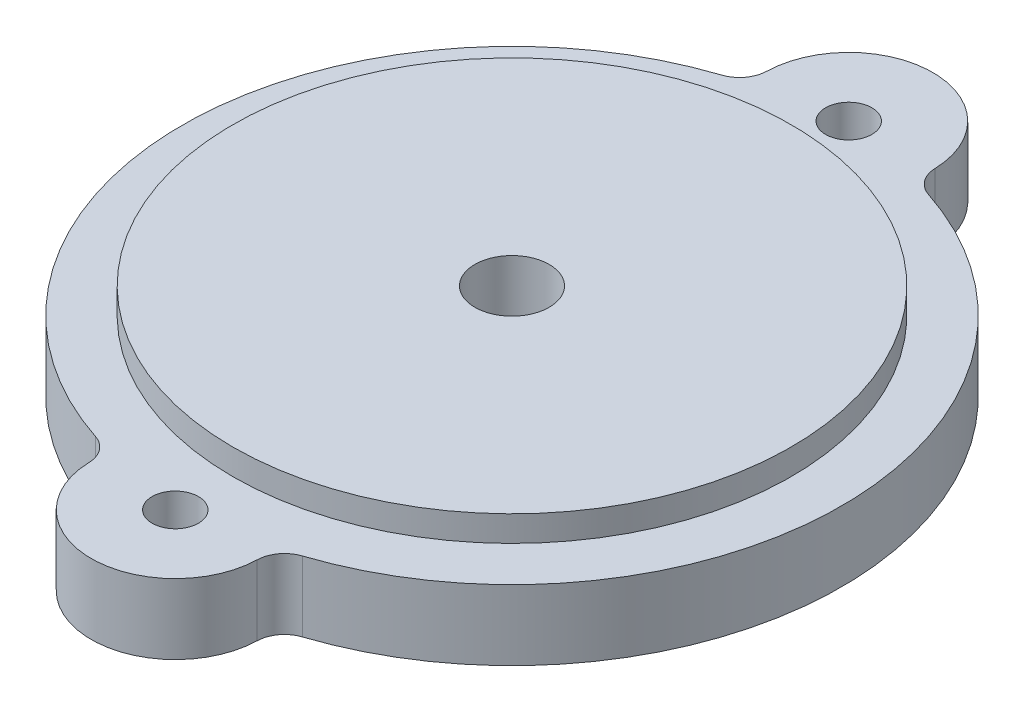
ISO-10303-21;
HEADER;
FILE_DESCRIPTION(('STEP AP214'),'2;1');
FILE_NAME('part.step','',(''),(''),'','','');
FILE_SCHEMA(('AUTOMOTIVE_DESIGN { 1 0 10303 214 1 1 1 1 }'));
ENDSEC;
DATA;
#1=APPLICATION_CONTEXT('core data for automotive mechanical design processes');
#2=APPLICATION_PROTOCOL_DEFINITION('international standard','automotive_design',2000,#1);
#3=PRODUCT_CONTEXT('',#1,'mechanical');
#4=PRODUCT('Part','Part','',(#3));
#5=PRODUCT_RELATED_PRODUCT_CATEGORY('part','',(#4));
#6=PRODUCT_DEFINITION_FORMATION('','',#4);
#7=PRODUCT_DEFINITION_CONTEXT('part definition',#1,'design');
#8=PRODUCT_DEFINITION('design','',#6,#7);
#9=PRODUCT_DEFINITION_SHAPE('','',#8);
#10=(LENGTH_UNIT() NAMED_UNIT(*) SI_UNIT(.MILLI.,.METRE.));
#11=(NAMED_UNIT(*) PLANE_ANGLE_UNIT() SI_UNIT($,.RADIAN.));
#12=(NAMED_UNIT(*) SI_UNIT($,.STERADIAN.) SOLID_ANGLE_UNIT());
#13=UNCERTAINTY_MEASURE_WITH_UNIT(LENGTH_MEASURE(1.E-05),#10,'distance_accuracy_value','');
#14=(GEOMETRIC_REPRESENTATION_CONTEXT(3) GLOBAL_UNCERTAINTY_ASSIGNED_CONTEXT((#13)) GLOBAL_UNIT_ASSIGNED_CONTEXT((#10,
#11,#12)) REPRESENTATION_CONTEXT('',''));
#15=CARTESIAN_POINT('',(0.,0.,0.));
#16=DIRECTION('',(0.,0.,1.));
#17=DIRECTION('',(1.,0.,0.));
#18=AXIS2_PLACEMENT_3D('',#15,#16,#17);
#19=CARTESIAN_POINT('',(0.,5.,0.));
#20=DIRECTION('',(0.,-1.,0.));
#21=DIRECTION('',(0.,0.,-1.));
#22=AXIS2_PLACEMENT_3D('',#19,#20,#21);
#23=PLANE('',#22);
#24=CARTESIAN_POINT('',(0.,5.,0.));
#25=DIRECTION('',(0.,1.,0.));
#26=DIRECTION('',(0.,0.,1.));
#27=AXIS2_PLACEMENT_3D('',#24,#25,#26);
#28=CIRCLE('',#27,19.9);
#29=CARTESIAN_POINT('',(0.,5.,19.9));
#30=VERTEX_POINT('',#29);
#31=EDGE_CURVE('E125',#30,#30,#28,.T.);
#32=ORIENTED_EDGE('',*,*,#31,.F.);
#33=EDGE_LOOP('',(#32));
#34=FACE_BOUND('',#33,.T.);
#35=CARTESIAN_POINT('',(0.,5.,-24.));
#36=DIRECTION('',(0.,1.,0.));
#37=DIRECTION('',(0.,0.,1.));
#38=AXIS2_PLACEMENT_3D('',#35,#36,#37);
#39=CIRCLE('',#38,1.65);
#40=CARTESIAN_POINT('',(0.,5.,-22.35));
#41=VERTEX_POINT('',#40);
#42=EDGE_CURVE('E206',#41,#41,#39,.T.);
#43=ORIENTED_EDGE('',*,*,#42,.F.);
#44=EDGE_LOOP('',(#43));
#45=FACE_BOUND('',#44,.T.);
#46=CARTESIAN_POINT('',(-1.64121657312517E-13,5.,24.));
#47=DIRECTION('',(0.,1.,0.));
#48=DIRECTION('',(0.,0.,1.));
#49=AXIS2_PLACEMENT_3D('',#46,#47,#48);
#50=CIRCLE('',#49,1.65);
#51=CARTESIAN_POINT('',(-1.64121657312517E-13,5.,25.65));
#52=VERTEX_POINT('',#51);
#53=EDGE_CURVE('E207',#52,#52,#50,.T.);
#54=ORIENTED_EDGE('',*,*,#53,.F.);
#55=EDGE_LOOP('',(#54));
#56=FACE_BOUND('',#55,.T.);
#57=CARTESIAN_POINT('',(-1.64121657312517E-13,5.,24.));
#58=DIRECTION('',(0.,1.,0.));
#59=DIRECTION('',(0.,0.,1.));
#60=AXIS2_PLACEMENT_3D('',#57,#58,#59);
#61=CIRCLE('',#60,6.);
#62=CARTESIAN_POINT('',(-5.99786211708705,5.,24.16015625));
#63=VERTEX_POINT('',#62);
#64=CARTESIAN_POINT('',(5.99786211708672,5.,24.16015625));
#65=VERTEX_POINT('',#64);
#66=EDGE_CURVE('E120',#63,#65,#61,.T.);
#67=ORIENTED_EDGE('',*,*,#66,.T.);
#68=CARTESIAN_POINT('',(7.99714948944901,5.,24.2135416666667));
#69=DIRECTION('',(0.,-1.,0.));
#70=DIRECTION('',(0.,0.,-1.));
#71=AXIS2_PLACEMENT_3D('',#68,#69,#70);
#72=CIRCLE('',#71,2.);
#73=CARTESIAN_POINT('',(7.36992207851183,5.,22.3144403594772));
#74=VERTEX_POINT('',#73);
#75=EDGE_CURVE('E182',#65,#74,#72,.T.);
#76=ORIENTED_EDGE('',*,*,#75,.T.);
#77=CARTESIAN_POINT('',(0.,5.,0.));
#78=DIRECTION('',(0.,1.,0.));
#79=DIRECTION('',(0.,0.,1.));
#80=AXIS2_PLACEMENT_3D('',#77,#78,#79);
#81=CIRCLE('',#80,23.5);
#82=CARTESIAN_POINT('',(7.36992207851198,5.,-22.3144403594771));
#83=VERTEX_POINT('',#82);
#84=EDGE_CURVE('E186',#74,#83,#81,.T.);
#85=ORIENTED_EDGE('',*,*,#84,.T.);
#86=CARTESIAN_POINT('',(7.99714948944917,5.,-24.2135416666667));
#87=DIRECTION('',(0.,-1.,0.));
#88=DIRECTION('',(0.,0.,-1.));
#89=AXIS2_PLACEMENT_3D('',#86,#87,#88);
#90=CIRCLE('',#89,2.);
#91=CARTESIAN_POINT('',(5.99786211708688,5.,-24.16015625));
#92=VERTEX_POINT('',#91);
#93=EDGE_CURVE('E69',#83,#92,#90,.T.);
#94=ORIENTED_EDGE('',*,*,#93,.T.);
#95=CARTESIAN_POINT('',(0.,5.,-24.));
#96=DIRECTION('',(0.,1.,0.));
#97=DIRECTION('',(0.,0.,1.));
#98=AXIS2_PLACEMENT_3D('',#95,#96,#97);
#99=CIRCLE('',#98,6.);
#100=CARTESIAN_POINT('',(-5.99786211708688,5.,-24.16015625));
#101=VERTEX_POINT('',#100);
#102=EDGE_CURVE('E159',#92,#101,#99,.T.);
#103=ORIENTED_EDGE('',*,*,#102,.T.);
#104=CARTESIAN_POINT('',(-7.99714948944918,5.,-24.2135416666667));
#105=DIRECTION('',(0.,-1.,0.));
#106=DIRECTION('',(0.,0.,-1.));
#107=AXIS2_PLACEMENT_3D('',#104,#105,#106);
#108=CIRCLE('',#107,2.);
#109=CARTESIAN_POINT('',(-7.36992207851199,5.,-22.3144403594771));
#110=VERTEX_POINT('',#109);
#111=EDGE_CURVE('E55',#101,#110,#108,.T.);
#112=ORIENTED_EDGE('',*,*,#111,.T.);
#113=CARTESIAN_POINT('',(0.,5.,0.));
#114=DIRECTION('',(0.,1.,0.));
#115=DIRECTION('',(0.,0.,1.));
#116=AXIS2_PLACEMENT_3D('',#113,#114,#115);
#117=CIRCLE('',#116,23.5);
#118=CARTESIAN_POINT('',(-7.36992207851214,5.,22.3144403594771));
#119=VERTEX_POINT('',#118);
#120=EDGE_CURVE('E158',#110,#119,#117,.T.);
#121=ORIENTED_EDGE('',*,*,#120,.T.);
#122=CARTESIAN_POINT('',(-7.99714948944934,5.,24.2135416666666));
#123=DIRECTION('',(0.,-1.,0.));
#124=DIRECTION('',(0.,0.,-1.));
#125=AXIS2_PLACEMENT_3D('',#122,#123,#124);
#126=CIRCLE('',#125,2.);
#127=EDGE_CURVE('E145',#119,#63,#126,.T.);
#128=ORIENTED_EDGE('',*,*,#127,.T.);
#129=EDGE_LOOP('',(#67,#76,#85,#94,#103,#112,#121,#128));
#130=FACE_BOUND('',#129,.T.);
#131=ADVANCED_FACE('F46',(#34,#45,#56,#130),#23,.F.);
#132=CARTESIAN_POINT('',(0.,0.,0.));
#133=DIRECTION('',(0.,-1.,0.));
#134=DIRECTION('',(0.,0.,-1.));
#135=AXIS2_PLACEMENT_3D('',#132,#133,#134);
#136=PLANE('',#135);
#137=CARTESIAN_POINT('',(0.,0.,0.));
#138=DIRECTION('',(0.,-1.,0.));
#139=DIRECTION('',(0.,0.,-1.));
#140=AXIS2_PLACEMENT_3D('',#137,#138,#139);
#141=CIRCLE('',#140,2.65);
#142=CARTESIAN_POINT('',(0.,0.,-2.65));
#143=VERTEX_POINT('',#142);
#144=EDGE_CURVE('E237',#143,#143,#141,.T.);
#145=ORIENTED_EDGE('',*,*,#144,.F.);
#146=EDGE_LOOP('',(#145));
#147=FACE_BOUND('',#146,.T.);
#148=CARTESIAN_POINT('',(0.,0.,-24.));
#149=DIRECTION('',(0.,1.,0.));
#150=DIRECTION('',(0.,0.,1.));
#151=AXIS2_PLACEMENT_3D('',#148,#149,#150);
#152=CIRCLE('',#151,1.65);
#153=CARTESIAN_POINT('',(0.,0.,-22.35));
#154=VERTEX_POINT('',#153);
#155=EDGE_CURVE('E202',#154,#154,#152,.T.);
#156=ORIENTED_EDGE('',*,*,#155,.T.);
#157=EDGE_LOOP('',(#156));
#158=FACE_BOUND('',#157,.T.);
#159=CARTESIAN_POINT('',(-1.64121657312517E-13,0.,24.));
#160=DIRECTION('',(0.,1.,0.));
#161=DIRECTION('',(0.,0.,1.));
#162=AXIS2_PLACEMENT_3D('',#159,#160,#161);
#163=CIRCLE('',#162,1.65);
#164=CARTESIAN_POINT('',(-1.64121657312517E-13,0.,25.65));
#165=VERTEX_POINT('',#164);
#166=EDGE_CURVE('E211',#165,#165,#163,.T.);
#167=ORIENTED_EDGE('',*,*,#166,.T.);
#168=EDGE_LOOP('',(#167));
#169=FACE_BOUND('',#168,.T.);
#170=CARTESIAN_POINT('',(0.,0.,-24.));
#171=DIRECTION('',(0.,1.,0.));
#172=DIRECTION('',(0.,0.,-1.));
#173=AXIS2_PLACEMENT_3D('',#170,#171,#172);
#174=CIRCLE('',#173,6.);
#175=CARTESIAN_POINT('',(5.99786211708688,0.,-24.16015625));
#176=VERTEX_POINT('',#175);
#177=CARTESIAN_POINT('',(-5.99786211708688,0.,-24.16015625));
#178=VERTEX_POINT('',#177);
#179=EDGE_CURVE('E195',#176,#178,#174,.T.);
#180=ORIENTED_EDGE('',*,*,#179,.F.);
#181=CARTESIAN_POINT('',(7.99714948944917,0.,-24.2135416666667));
#182=DIRECTION('',(0.,-1.,0.));
#183=DIRECTION('',(0.,0.,-1.));
#184=AXIS2_PLACEMENT_3D('',#181,#182,#183);
#185=CIRCLE('',#184,2.);
#186=CARTESIAN_POINT('',(7.36992207851198,0.,-22.3144403594771));
#187=VERTEX_POINT('',#186);
#188=EDGE_CURVE('E149',#176,#187,#185,.F.);
#189=ORIENTED_EDGE('',*,*,#188,.T.);
#190=CARTESIAN_POINT('',(0.,0.,0.));
#191=DIRECTION('',(0.,1.,0.));
#192=DIRECTION('',(0.,0.,1.));
#193=AXIS2_PLACEMENT_3D('',#190,#191,#192);
#194=CIRCLE('',#193,23.5);
#195=CARTESIAN_POINT('',(7.36992207851183,0.,22.3144403594772));
#196=VERTEX_POINT('',#195);
#197=EDGE_CURVE('E137',#196,#187,#194,.T.);
#198=ORIENTED_EDGE('',*,*,#197,.F.);
#199=CARTESIAN_POINT('',(7.99714948944901,0.,24.2135416666667));
#200=DIRECTION('',(0.,-1.,0.));
#201=DIRECTION('',(0.,0.,-1.));
#202=AXIS2_PLACEMENT_3D('',#199,#200,#201);
#203=CIRCLE('',#202,2.);
#204=CARTESIAN_POINT('',(5.99786211708672,0.,24.16015625));
#205=VERTEX_POINT('',#204);
#206=EDGE_CURVE('E135',#196,#205,#203,.F.);
#207=ORIENTED_EDGE('',*,*,#206,.T.);
#208=CARTESIAN_POINT('',(-1.64121657312517E-13,0.,24.));
#209=DIRECTION('',(0.,1.,0.));
#210=DIRECTION('',(0.,0.,-1.));
#211=AXIS2_PLACEMENT_3D('',#208,#209,#210);
#212=CIRCLE('',#211,6.);
#213=CARTESIAN_POINT('',(-5.99786211708705,0.,24.16015625));
#214=VERTEX_POINT('',#213);
#215=EDGE_CURVE('E117',#214,#205,#212,.T.);
#216=ORIENTED_EDGE('',*,*,#215,.F.);
#217=CARTESIAN_POINT('',(-7.99714948944934,0.,24.2135416666666));
#218=DIRECTION('',(0.,-1.,0.));
#219=DIRECTION('',(0.,0.,-1.));
#220=AXIS2_PLACEMENT_3D('',#217,#218,#219);
#221=CIRCLE('',#220,2.);
#222=CARTESIAN_POINT('',(-7.36992207851214,0.,22.3144403594771));
#223=VERTEX_POINT('',#222);
#224=EDGE_CURVE('E131',#214,#223,#221,.F.);
#225=ORIENTED_EDGE('',*,*,#224,.T.);
#226=CARTESIAN_POINT('',(0.,0.,0.));
#227=DIRECTION('',(0.,1.,0.));
#228=DIRECTION('',(0.,0.,1.));
#229=AXIS2_PLACEMENT_3D('',#226,#227,#228);
#230=CIRCLE('',#229,23.5);
#231=CARTESIAN_POINT('',(-7.36992207851199,0.,-22.3144403594771));
#232=VERTEX_POINT('',#231);
#233=EDGE_CURVE('E138',#232,#223,#230,.T.);
#234=ORIENTED_EDGE('',*,*,#233,.F.);
#235=CARTESIAN_POINT('',(-7.99714948944918,0.,-24.2135416666667));
#236=DIRECTION('',(0.,-1.,0.));
#237=DIRECTION('',(0.,0.,-1.));
#238=AXIS2_PLACEMENT_3D('',#235,#236,#237);
#239=CIRCLE('',#238,2.);
#240=EDGE_CURVE('E12',#232,#178,#239,.F.);
#241=ORIENTED_EDGE('',*,*,#240,.T.);
#242=EDGE_LOOP('',(#180,#189,#198,#207,#216,#225,#234,#241));
#243=FACE_BOUND('',#242,.T.);
#244=ADVANCED_FACE('F129',(#147,#158,#169,#243),#136,.T.);
#245=CARTESIAN_POINT('',(0.,5.,-24.));
#246=DIRECTION('',(0.,-1.,0.));
#247=DIRECTION('',(0.,0.,-1.));
#248=AXIS2_PLACEMENT_3D('',#245,#246,#247);
#249=CYLINDRICAL_SURFACE('',#248,1.65);
#250=ORIENTED_EDGE('',*,*,#42,.T.);
#251=EDGE_LOOP('',(#250));
#252=FACE_BOUND('',#251,.T.);
#253=ORIENTED_EDGE('',*,*,#155,.F.);
#254=EDGE_LOOP('',(#253));
#255=FACE_BOUND('',#254,.T.);
#256=ADVANCED_FACE('F256',(#252,#255),#249,.F.);
#257=CARTESIAN_POINT('',(-1.64121657312517E-13,5.,24.));
#258=DIRECTION('',(0.,-1.,0.));
#259=DIRECTION('',(0.,0.,-1.));
#260=AXIS2_PLACEMENT_3D('',#257,#258,#259);
#261=CYLINDRICAL_SURFACE('',#260,1.65);
#262=ORIENTED_EDGE('',*,*,#53,.T.);
#263=EDGE_LOOP('',(#262));
#264=FACE_BOUND('',#263,.T.);
#265=ORIENTED_EDGE('',*,*,#166,.F.);
#266=EDGE_LOOP('',(#265));
#267=FACE_BOUND('',#266,.T.);
#268=ADVANCED_FACE('F262',(#264,#267),#261,.F.);
#269=CARTESIAN_POINT('',(0.,6.83,0.));
#270=DIRECTION('',(0.,-1.,0.));
#271=DIRECTION('',(0.,0.,-1.));
#272=AXIS2_PLACEMENT_3D('',#269,#270,#271);
#273=CYLINDRICAL_SURFACE('',#272,19.9);
#274=CARTESIAN_POINT('',(0.,6.83,0.));
#275=DIRECTION('',(0.,1.,0.));
#276=DIRECTION('',(0.,0.,1.));
#277=AXIS2_PLACEMENT_3D('',#274,#275,#276);
#278=CIRCLE('',#277,19.9);
#279=CARTESIAN_POINT('',(0.,6.83,19.9));
#280=VERTEX_POINT('',#279);
#281=EDGE_CURVE('E215',#280,#280,#278,.T.);
#282=ORIENTED_EDGE('',*,*,#281,.F.);
#283=EDGE_LOOP('',(#282));
#284=FACE_BOUND('',#283,.T.);
#285=ORIENTED_EDGE('',*,*,#31,.T.);
#286=EDGE_LOOP('',(#285));
#287=FACE_BOUND('',#286,.T.);
#288=ADVANCED_FACE('F264',(#284,#287),#273,.T.);
#289=CARTESIAN_POINT('',(0.,6.83,0.));
#290=DIRECTION('',(0.,1.,0.));
#291=DIRECTION('',(0.,0.,1.));
#292=AXIS2_PLACEMENT_3D('',#289,#290,#291);
#293=PLANE('',#292);
#294=CARTESIAN_POINT('',(0.,6.83,0.));
#295=DIRECTION('',(0.,-1.,0.));
#296=DIRECTION('',(0.,0.,-1.));
#297=AXIS2_PLACEMENT_3D('',#294,#295,#296);
#298=CIRCLE('',#297,2.65);
#299=CARTESIAN_POINT('',(0.,6.83,-2.65));
#300=VERTEX_POINT('',#299);
#301=EDGE_CURVE('E229',#300,#300,#298,.T.);
#302=ORIENTED_EDGE('',*,*,#301,.T.);
#303=EDGE_LOOP('',(#302));
#304=FACE_BOUND('',#303,.T.);
#305=ORIENTED_EDGE('',*,*,#281,.T.);
#306=EDGE_LOOP('',(#305));
#307=FACE_BOUND('',#306,.T.);
#308=ADVANCED_FACE('F245',(#304,#307),#293,.T.);
#309=CARTESIAN_POINT('',(0.,0.,-24.));
#310=DIRECTION('',(0.,1.,0.));
#311=DIRECTION('',(0.,0.,1.));
#312=AXIS2_PLACEMENT_3D('',#309,#310,#311);
#313=CYLINDRICAL_SURFACE('',#312,6.);
#314=ORIENTED_EDGE('',*,*,#102,.F.);
#315=DIRECTION('',(0.,1.,0.));
#316=VECTOR('',#315,1.);
#317=CARTESIAN_POINT('',(5.99786211708688,0.,-24.16015625));
#318=LINE('',#317,#316);
#319=EDGE_CURVE('E179',#92,#176,#318,.F.);
#320=ORIENTED_EDGE('',*,*,#319,.T.);
#321=ORIENTED_EDGE('',*,*,#179,.T.);
#322=DIRECTION('',(0.,1.,0.));
#323=VECTOR('',#322,1.);
#324=CARTESIAN_POINT('',(-5.99786211708688,0.,-24.16015625));
#325=LINE('',#324,#323);
#326=EDGE_CURVE('E171',#178,#101,#325,.T.);
#327=ORIENTED_EDGE('',*,*,#326,.T.);
#328=EDGE_LOOP('',(#314,#320,#321,#327));
#329=FACE_BOUND('',#328,.T.);
#330=ADVANCED_FACE('F295',(#329),#313,.T.);
#331=CARTESIAN_POINT('',(-1.64121657312517E-13,0.,24.));
#332=DIRECTION('',(0.,1.,0.));
#333=DIRECTION('',(0.,0.,1.));
#334=AXIS2_PLACEMENT_3D('',#331,#332,#333);
#335=CYLINDRICAL_SURFACE('',#334,6.);
#336=ORIENTED_EDGE('',*,*,#215,.T.);
#337=DIRECTION('',(0.,1.,0.));
#338=VECTOR('',#337,1.);
#339=CARTESIAN_POINT('',(5.99786211708672,0.,24.16015625));
#340=LINE('',#339,#338);
#341=EDGE_CURVE('E124',#205,#65,#340,.T.);
#342=ORIENTED_EDGE('',*,*,#341,.T.);
#343=ORIENTED_EDGE('',*,*,#66,.F.);
#344=DIRECTION('',(0.,1.,0.));
#345=VECTOR('',#344,1.);
#346=CARTESIAN_POINT('',(-5.99786211708705,0.,24.16015625));
#347=LINE('',#346,#345);
#348=EDGE_CURVE('E113',#63,#214,#347,.F.);
#349=ORIENTED_EDGE('',*,*,#348,.T.);
#350=EDGE_LOOP('',(#336,#342,#343,#349));
#351=FACE_BOUND('',#350,.T.);
#352=ADVANCED_FACE('F115',(#351),#335,.T.);
#353=CARTESIAN_POINT('',(0.,0.,0.));
#354=DIRECTION('',(0.,1.,0.));
#355=DIRECTION('',(0.,0.,1.));
#356=AXIS2_PLACEMENT_3D('',#353,#354,#355);
#357=CYLINDRICAL_SURFACE('',#356,23.5);
#358=ORIENTED_EDGE('',*,*,#84,.F.);
#359=DIRECTION('',(0.,1.,0.));
#360=VECTOR('',#359,1.);
#361=CARTESIAN_POINT('',(7.36992207851183,0.,22.3144403594772));
#362=LINE('',#361,#360);
#363=EDGE_CURVE('E167',#74,#196,#362,.F.);
#364=ORIENTED_EDGE('',*,*,#363,.T.);
#365=ORIENTED_EDGE('',*,*,#197,.T.);
#366=DIRECTION('',(0.,1.,0.));
#367=VECTOR('',#366,1.);
#368=CARTESIAN_POINT('',(7.36992207851198,0.,-22.3144403594771));
#369=LINE('',#368,#367);
#370=EDGE_CURVE('E173',#187,#83,#369,.T.);
#371=ORIENTED_EDGE('',*,*,#370,.T.);
#372=EDGE_LOOP('',(#358,#364,#365,#371));
#373=FACE_BOUND('',#372,.T.);
#374=ADVANCED_FACE('F191',(#373),#357,.T.);
#375=CARTESIAN_POINT('',(0.,0.,0.));
#376=DIRECTION('',(0.,1.,0.));
#377=DIRECTION('',(0.,0.,1.));
#378=AXIS2_PLACEMENT_3D('',#375,#376,#377);
#379=CYLINDRICAL_SURFACE('',#378,23.5);
#380=ORIENTED_EDGE('',*,*,#233,.T.);
#381=DIRECTION('',(0.,1.,0.));
#382=VECTOR('',#381,1.);
#383=CARTESIAN_POINT('',(-7.36992207851214,0.,22.3144403594771));
#384=LINE('',#383,#382);
#385=EDGE_CURVE('E143',#223,#119,#384,.T.);
#386=ORIENTED_EDGE('',*,*,#385,.T.);
#387=ORIENTED_EDGE('',*,*,#120,.F.);
#388=DIRECTION('',(0.,1.,0.));
#389=VECTOR('',#388,1.);
#390=CARTESIAN_POINT('',(-7.36992207851199,0.,-22.3144403594771));
#391=LINE('',#390,#389);
#392=EDGE_CURVE('E162',#110,#232,#391,.F.);
#393=ORIENTED_EDGE('',*,*,#392,.T.);
#394=EDGE_LOOP('',(#380,#386,#387,#393));
#395=FACE_BOUND('',#394,.T.);
#396=ADVANCED_FACE('F161',(#395),#379,.T.);
#397=CARTESIAN_POINT('',(0.,6.83,0.));
#398=DIRECTION('',(0.,-1.,0.));
#399=DIRECTION('',(0.,0.,-1.));
#400=AXIS2_PLACEMENT_3D('',#397,#398,#399);
#401=CYLINDRICAL_SURFACE('',#400,2.65);
#402=ORIENTED_EDGE('',*,*,#301,.F.);
#403=EDGE_LOOP('',(#402));
#404=FACE_BOUND('',#403,.T.);
#405=ORIENTED_EDGE('',*,*,#144,.T.);
#406=EDGE_LOOP('',(#405));
#407=FACE_BOUND('',#406,.T.);
#408=ADVANCED_FACE('F248',(#404,#407),#401,.F.);
#409=CARTESIAN_POINT('',(7.99714948944901,0.,24.2135416666667));
#410=DIRECTION('',(0.,-1.,0.));
#411=DIRECTION('',(0.,0.,-1.));
#412=AXIS2_PLACEMENT_3D('',#409,#410,#411);
#413=CYLINDRICAL_SURFACE('',#412,2.);
#414=ORIENTED_EDGE('',*,*,#206,.F.);
#415=ORIENTED_EDGE('',*,*,#363,.F.);
#416=ORIENTED_EDGE('',*,*,#75,.F.);
#417=ORIENTED_EDGE('',*,*,#341,.F.);
#418=EDGE_LOOP('',(#414,#415,#416,#417));
#419=FACE_BOUND('',#418,.T.);
#420=ADVANCED_FACE('F197',(#419),#413,.F.);
#421=CARTESIAN_POINT('',(-7.99714948944934,0.,24.2135416666666));
#422=DIRECTION('',(0.,-1.,0.));
#423=DIRECTION('',(0.,0.,-1.));
#424=AXIS2_PLACEMENT_3D('',#421,#422,#423);
#425=CYLINDRICAL_SURFACE('',#424,2.);
#426=ORIENTED_EDGE('',*,*,#224,.F.);
#427=ORIENTED_EDGE('',*,*,#348,.F.);
#428=ORIENTED_EDGE('',*,*,#127,.F.);
#429=ORIENTED_EDGE('',*,*,#385,.F.);
#430=EDGE_LOOP('',(#426,#427,#428,#429));
#431=FACE_BOUND('',#430,.T.);
#432=ADVANCED_FACE('F141',(#431),#425,.F.);
#433=CARTESIAN_POINT('',(7.99714948944917,0.,-24.2135416666667));
#434=DIRECTION('',(0.,-1.,0.));
#435=DIRECTION('',(0.,0.,-1.));
#436=AXIS2_PLACEMENT_3D('',#433,#434,#435);
#437=CYLINDRICAL_SURFACE('',#436,2.);
#438=ORIENTED_EDGE('',*,*,#188,.F.);
#439=ORIENTED_EDGE('',*,*,#319,.F.);
#440=ORIENTED_EDGE('',*,*,#93,.F.);
#441=ORIENTED_EDGE('',*,*,#370,.F.);
#442=EDGE_LOOP('',(#438,#439,#440,#441));
#443=FACE_BOUND('',#442,.T.);
#444=ADVANCED_FACE('F286',(#443),#437,.F.);
#445=CARTESIAN_POINT('',(-7.99714948944918,0.,-24.2135416666667));
#446=DIRECTION('',(0.,-1.,0.));
#447=DIRECTION('',(0.,0.,-1.));
#448=AXIS2_PLACEMENT_3D('',#445,#446,#447);
#449=CYLINDRICAL_SURFACE('',#448,2.);
#450=ORIENTED_EDGE('',*,*,#240,.F.);
#451=ORIENTED_EDGE('',*,*,#392,.F.);
#452=ORIENTED_EDGE('',*,*,#111,.F.);
#453=ORIENTED_EDGE('',*,*,#326,.F.);
#454=EDGE_LOOP('',(#450,#451,#452,#453));
#455=FACE_BOUND('',#454,.T.);
#456=ADVANCED_FACE('F48',(#455),#449,.F.);
#457=CLOSED_SHELL('',(#131,#244,#256,#268,#288,#308,#330,#352,#374,#396,#408,#420,#432,#444,#456));
#458=MANIFOLD_SOLID_BREP('B2',#457);
#459=ADVANCED_BREP_SHAPE_REPRESENTATION('',(#18,#458),#14);
#460=SHAPE_DEFINITION_REPRESENTATION(#9,#459);
ENDSEC;
END-ISO-10303-21;
